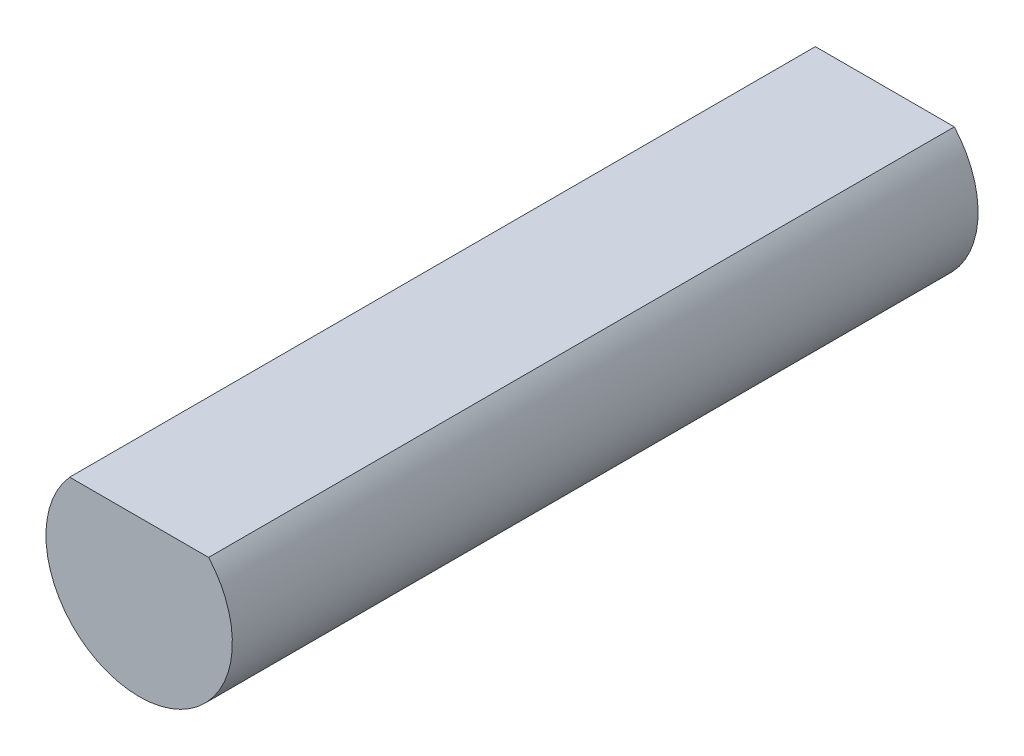
ISO-10303-21;
HEADER;
FILE_DESCRIPTION(('STEP AP214'),'2;1');
FILE_NAME('part.step','',(''),(''),'','','');
FILE_SCHEMA(('AUTOMOTIVE_DESIGN { 1 0 10303 214 1 1 1 1 }'));
ENDSEC;
DATA;
#1=APPLICATION_CONTEXT('core data for automotive mechanical design processes');
#2=APPLICATION_PROTOCOL_DEFINITION('international standard','automotive_design',2000,#1);
#3=PRODUCT_CONTEXT('',#1,'mechanical');
#4=PRODUCT('Part','Part','',(#3));
#5=PRODUCT_RELATED_PRODUCT_CATEGORY('part','',(#4));
#6=PRODUCT_DEFINITION_FORMATION('','',#4);
#7=PRODUCT_DEFINITION_CONTEXT('part definition',#1,'design');
#8=PRODUCT_DEFINITION('design','',#6,#7);
#9=PRODUCT_DEFINITION_SHAPE('','',#8);
#10=(LENGTH_UNIT() NAMED_UNIT(*) SI_UNIT(.MILLI.,.METRE.));
#11=(NAMED_UNIT(*) PLANE_ANGLE_UNIT() SI_UNIT($,.RADIAN.));
#12=(NAMED_UNIT(*) SI_UNIT($,.STERADIAN.) SOLID_ANGLE_UNIT());
#13=UNCERTAINTY_MEASURE_WITH_UNIT(LENGTH_MEASURE(1.E-05),#10,'distance_accuracy_value','');
#14=(GEOMETRIC_REPRESENTATION_CONTEXT(3) GLOBAL_UNCERTAINTY_ASSIGNED_CONTEXT((#13)) GLOBAL_UNIT_ASSIGNED_CONTEXT((#10,
#11,#12)) REPRESENTATION_CONTEXT('',''));
#15=CARTESIAN_POINT('',(0.,0.,0.));
#16=DIRECTION('',(0.,0.,1.));
#17=DIRECTION('',(1.,0.,0.));
#18=AXIS2_PLACEMENT_3D('',#15,#16,#17);
#19=CARTESIAN_POINT('',(0.,0.,12.));
#20=DIRECTION('',(0.,0.,-1.));
#21=DIRECTION('',(-1.,0.,0.));
#22=AXIS2_PLACEMENT_3D('',#19,#20,#21);
#23=CYLINDRICAL_SURFACE('',#22,1.5);
#24=CARTESIAN_POINT('',(0.,0.,0.));
#25=DIRECTION('',(0.,0.,1.));
#26=DIRECTION('',(1.,0.,0.));
#27=AXIS2_PLACEMENT_3D('',#24,#25,#26);
#28=CIRCLE('',#27,1.5);
#29=CARTESIAN_POINT('',(-1.1180339887499,0.999999999999999,0.));
#30=VERTEX_POINT('',#29);
#31=CARTESIAN_POINT('',(1.1180339887499,0.999999999999999,0.));
#32=VERTEX_POINT('',#31);
#33=EDGE_CURVE('E72',#30,#32,#28,.T.);
#34=ORIENTED_EDGE('',*,*,#33,.T.);
#35=DIRECTION('',(0.,0.,-1.));
#36=VECTOR('',#35,1.);
#37=CARTESIAN_POINT('',(1.1180339887499,0.999999999999999,12.));
#38=LINE('',#37,#36);
#39=CARTESIAN_POINT('',(1.1180339887499,0.999999999999999,12.));
#40=VERTEX_POINT('',#39);
#41=EDGE_CURVE('E11',#40,#32,#38,.T.);
#42=ORIENTED_EDGE('',*,*,#41,.F.);
#43=CARTESIAN_POINT('',(0.,0.,12.));
#44=DIRECTION('',(0.,0.,1.));
#45=DIRECTION('',(1.,0.,0.));
#46=AXIS2_PLACEMENT_3D('',#43,#44,#45);
#47=CIRCLE('',#46,1.5);
#48=CARTESIAN_POINT('',(-1.1180339887499,0.999999999999999,12.));
#49=VERTEX_POINT('',#48);
#50=EDGE_CURVE('E71',#49,#40,#47,.T.);
#51=ORIENTED_EDGE('',*,*,#50,.F.);
#52=DIRECTION('',(0.,0.,-1.));
#53=VECTOR('',#52,1.);
#54=CARTESIAN_POINT('',(-1.1180339887499,0.999999999999999,12.));
#55=LINE('',#54,#53);
#56=EDGE_CURVE('E48',#49,#30,#55,.T.);
#57=ORIENTED_EDGE('',*,*,#56,.T.);
#58=EDGE_LOOP('',(#34,#42,#51,#57));
#59=FACE_BOUND('',#58,.T.);
#60=ADVANCED_FACE('F39',(#59),#23,.T.);
#61=CARTESIAN_POINT('',(-1.1180339887499,0.999999999999999,12.));
#62=DIRECTION('',(0.,-1.,0.));
#63=DIRECTION('',(0.,0.,-1.));
#64=AXIS2_PLACEMENT_3D('',#61,#62,#63);
#65=PLANE('',#64);
#66=DIRECTION('',(-1.,0.,0.));
#67=VECTOR('',#66,1.);
#68=CARTESIAN_POINT('',(-1.1180339887499,0.999999999999999,0.));
#69=LINE('',#68,#67);
#70=EDGE_CURVE('E63',#32,#30,#69,.T.);
#71=ORIENTED_EDGE('',*,*,#70,.T.);
#72=ORIENTED_EDGE('',*,*,#56,.F.);
#73=DIRECTION('',(-1.,0.,0.));
#74=VECTOR('',#73,1.);
#75=CARTESIAN_POINT('',(-1.1180339887499,0.999999999999999,12.));
#76=LINE('',#75,#74);
#77=EDGE_CURVE('E55',#40,#49,#76,.T.);
#78=ORIENTED_EDGE('',*,*,#77,.F.);
#79=ORIENTED_EDGE('',*,*,#41,.T.);
#80=EDGE_LOOP('',(#71,#72,#78,#79));
#81=FACE_BOUND('',#80,.T.);
#82=ADVANCED_FACE('F66',(#81),#65,.F.);
#83=CARTESIAN_POINT('',(0.,0.,12.));
#84=DIRECTION('',(0.,0.,1.));
#85=DIRECTION('',(1.,0.,0.));
#86=AXIS2_PLACEMENT_3D('',#83,#84,#85);
#87=PLANE('',#86);
#88=ORIENTED_EDGE('',*,*,#50,.T.);
#89=ORIENTED_EDGE('',*,*,#77,.T.);
#90=EDGE_LOOP('',(#88,#89));
#91=FACE_BOUND('',#90,.T.);
#92=ADVANCED_FACE('F83',(#91),#87,.T.);
#93=CARTESIAN_POINT('',(0.,0.,0.));
#94=DIRECTION('',(0.,0.,1.));
#95=DIRECTION('',(1.,0.,0.));
#96=AXIS2_PLACEMENT_3D('',#93,#94,#95);
#97=PLANE('',#96);
#98=ORIENTED_EDGE('',*,*,#33,.F.);
#99=ORIENTED_EDGE('',*,*,#70,.F.);
#100=EDGE_LOOP('',(#98,#99));
#101=FACE_BOUND('',#100,.T.);
#102=ADVANCED_FACE('F76',(#101),#97,.F.);
#103=CLOSED_SHELL('',(#60,#82,#92,#102));
#104=MANIFOLD_SOLID_BREP('B2',#103);
#105=ADVANCED_BREP_SHAPE_REPRESENTATION('',(#18,#104),#14);
#106=SHAPE_DEFINITION_REPRESENTATION(#9,#105);
ENDSEC;
END-ISO-10303-21;
